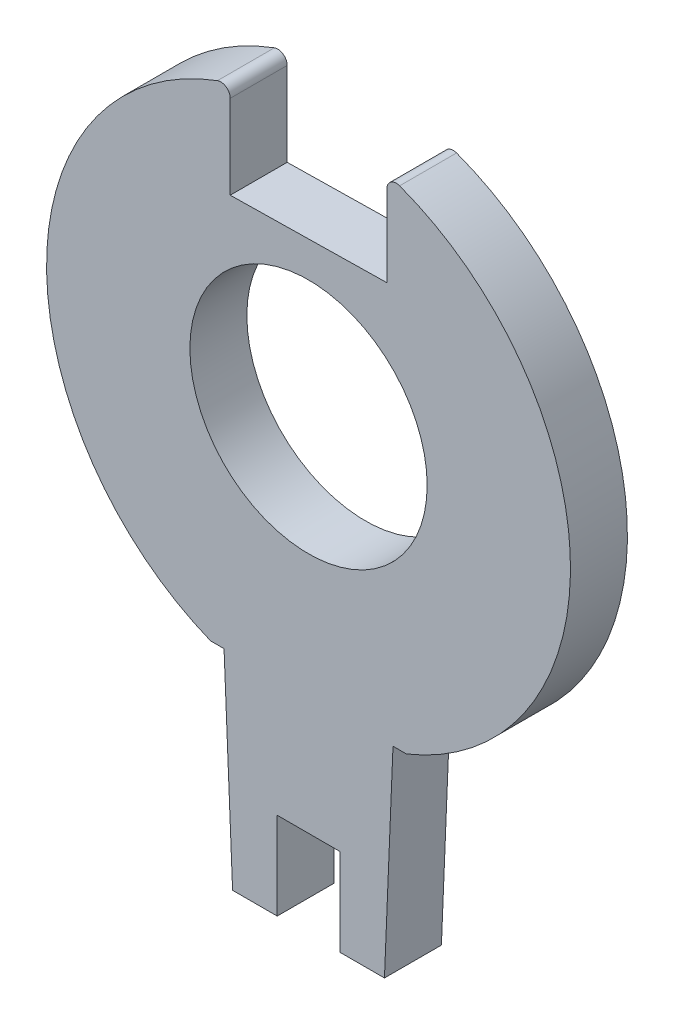
ISO-10303-21;
HEADER;
FILE_DESCRIPTION(('STEP AP214'),'2;1');
FILE_NAME('part.step','',(''),(''),'','','');
FILE_SCHEMA(('AUTOMOTIVE_DESIGN { 1 0 10303 214 1 1 1 1 }'));
ENDSEC;
DATA;
#1=APPLICATION_CONTEXT('core data for automotive mechanical design processes');
#2=APPLICATION_PROTOCOL_DEFINITION('international standard','automotive_design',2000,#1);
#3=PRODUCT_CONTEXT('',#1,'mechanical');
#4=PRODUCT('Part','Part','',(#3));
#5=PRODUCT_RELATED_PRODUCT_CATEGORY('part','',(#4));
#6=PRODUCT_DEFINITION_FORMATION('','',#4);
#7=PRODUCT_DEFINITION_CONTEXT('part definition',#1,'design');
#8=PRODUCT_DEFINITION('design','',#6,#7);
#9=PRODUCT_DEFINITION_SHAPE('','',#8);
#10=(LENGTH_UNIT() NAMED_UNIT(*) SI_UNIT(.MILLI.,.METRE.));
#11=(NAMED_UNIT(*) PLANE_ANGLE_UNIT() SI_UNIT($,.RADIAN.));
#12=(NAMED_UNIT(*) SI_UNIT($,.STERADIAN.) SOLID_ANGLE_UNIT());
#13=UNCERTAINTY_MEASURE_WITH_UNIT(LENGTH_MEASURE(1.E-05),#10,'distance_accuracy_value','');
#14=(GEOMETRIC_REPRESENTATION_CONTEXT(3) GLOBAL_UNCERTAINTY_ASSIGNED_CONTEXT((#13)) GLOBAL_UNIT_ASSIGNED_CONTEXT((#10,
#11,#12)) REPRESENTATION_CONTEXT('',''));
#15=CARTESIAN_POINT('',(0.,0.,0.));
#16=DIRECTION('',(0.,0.,1.));
#17=DIRECTION('',(1.,0.,0.));
#18=AXIS2_PLACEMENT_3D('',#15,#16,#17);
#19=CARTESIAN_POINT('',(0.,0.,3.));
#20=DIRECTION('',(0.,0.,1.));
#21=DIRECTION('',(1.,0.,0.));
#22=AXIS2_PLACEMENT_3D('',#19,#20,#21);
#23=PLANE('',#22);
#24=DIRECTION('',(0.0416305447121813,-0.999133073092352,0.));
#25=VECTOR('',#24,1.);
#26=CARTESIAN_POINT('',(-4.45,-12.8,3.));
#27=LINE('',#26,#25);
#28=CARTESIAN_POINT('',(-4.45,-12.8,3.));
#29=VERTEX_POINT('',#28);
#30=CARTESIAN_POINT('',(-4.,-23.6,3.));
#31=VERTEX_POINT('',#30);
#32=EDGE_CURVE('E212',#29,#31,#27,.T.);
#33=ORIENTED_EDGE('',*,*,#32,.T.);
#34=DIRECTION('',(1.,0.,0.));
#35=VECTOR('',#34,1.);
#36=CARTESIAN_POINT('',(-1.65,-23.6,3.));
#37=LINE('',#36,#35);
#38=CARTESIAN_POINT('',(-1.65,-23.6,3.));
#39=VERTEX_POINT('',#38);
#40=EDGE_CURVE('E120',#31,#39,#37,.T.);
#41=ORIENTED_EDGE('',*,*,#40,.T.);
#42=DIRECTION('',(0.,1.,0.));
#43=VECTOR('',#42,1.);
#44=CARTESIAN_POINT('',(-1.65,-23.6,3.));
#45=LINE('',#44,#43);
#46=CARTESIAN_POINT('',(-1.65,-19.,3.));
#47=VERTEX_POINT('',#46);
#48=EDGE_CURVE('E251',#39,#47,#45,.T.);
#49=ORIENTED_EDGE('',*,*,#48,.T.);
#50=DIRECTION('',(1.,0.,0.));
#51=VECTOR('',#50,1.);
#52=CARTESIAN_POINT('',(1.65,-19.,3.));
#53=LINE('',#52,#51);
#54=CARTESIAN_POINT('',(1.65,-19.,3.));
#55=VERTEX_POINT('',#54);
#56=EDGE_CURVE('E270',#47,#55,#53,.T.);
#57=ORIENTED_EDGE('',*,*,#56,.T.);
#58=DIRECTION('',(0.,-1.,0.));
#59=VECTOR('',#58,1.);
#60=CARTESIAN_POINT('',(1.65,-23.6,3.));
#61=LINE('',#60,#59);
#62=CARTESIAN_POINT('',(1.65,-23.6,3.));
#63=VERTEX_POINT('',#62);
#64=EDGE_CURVE('E267',#55,#63,#61,.T.);
#65=ORIENTED_EDGE('',*,*,#64,.T.);
#66=DIRECTION('',(1.,0.,0.));
#67=VECTOR('',#66,1.);
#68=CARTESIAN_POINT('',(4.,-23.6,3.));
#69=LINE('',#68,#67);
#70=CARTESIAN_POINT('',(4.,-23.6,3.));
#71=VERTEX_POINT('',#70);
#72=EDGE_CURVE('E269',#63,#71,#69,.T.);
#73=ORIENTED_EDGE('',*,*,#72,.T.);
#74=DIRECTION('',(0.0416305447121813,0.999133073092352,0.));
#75=VECTOR('',#74,1.);
#76=CARTESIAN_POINT('',(4.,-23.6,3.));
#77=LINE('',#76,#75);
#78=CARTESIAN_POINT('',(4.45,-12.8,3.));
#79=VERTEX_POINT('',#78);
#80=EDGE_CURVE('E272',#71,#79,#77,.T.);
#81=ORIENTED_EDGE('',*,*,#80,.T.);
#82=DIRECTION('',(1.,0.,0.));
#83=VECTOR('',#82,1.);
#84=CARTESIAN_POINT('',(4.45,-12.8,3.));
#85=LINE('',#84,#83);
#86=CARTESIAN_POINT('',(5.15751878329104,-12.8,3.));
#87=VERTEX_POINT('',#86);
#88=EDGE_CURVE('E278',#79,#87,#85,.T.);
#89=ORIENTED_EDGE('',*,*,#88,.T.);
#90=CARTESIAN_POINT('',(0.,0.,3.));
#91=DIRECTION('',(0.,0.,1.));
#92=DIRECTION('',(1.,0.,0.));
#93=AXIS2_PLACEMENT_3D('',#90,#91,#92);
#94=CIRCLE('',#93,13.8);
#95=CARTESIAN_POINT('',(4.79887218045113,12.9387335468234,3.));
#96=VERTEX_POINT('',#95);
#97=EDGE_CURVE('E280',#87,#96,#94,.T.);
#98=ORIENTED_EDGE('',*,*,#97,.T.);
#99=CARTESIAN_POINT('',(4.625,12.4699388530979,3.));
#100=DIRECTION('',(0.,0.,1.));
#101=DIRECTION('',(1.,0.,0.));
#102=AXIS2_PLACEMENT_3D('',#99,#100,#101);
#103=CIRCLE('',#102,0.499999999999999);
#104=CARTESIAN_POINT('',(4.125,12.4699388530979,3.));
#105=VERTEX_POINT('',#104);
#106=EDGE_CURVE('E282',#96,#105,#103,.T.);
#107=ORIENTED_EDGE('',*,*,#106,.T.);
#108=DIRECTION('',(0.,-1.,0.));
#109=VECTOR('',#108,1.);
#110=CARTESIAN_POINT('',(4.125,12.4699388530979,3.));
#111=LINE('',#110,#109);
#112=CARTESIAN_POINT('',(4.125,8.1852194205877,3.));
#113=VERTEX_POINT('',#112);
#114=EDGE_CURVE('E284',#105,#113,#111,.T.);
#115=ORIENTED_EDGE('',*,*,#114,.T.);
#116=DIRECTION('',(-0.999865707191088,-0.0163880317081075,0.));
#117=VECTOR('',#116,1.);
#118=CARTESIAN_POINT('',(-4.125,8.05,3.));
#119=LINE('',#118,#117);
#120=CARTESIAN_POINT('',(-4.125,8.05,3.));
#121=VERTEX_POINT('',#120);
#122=EDGE_CURVE('E286',#113,#121,#119,.T.);
#123=ORIENTED_EDGE('',*,*,#122,.T.);
#124=DIRECTION('',(0.,1.,0.));
#125=VECTOR('',#124,1.);
#126=CARTESIAN_POINT('',(-4.125,8.05,3.));
#127=LINE('',#126,#125);
#128=CARTESIAN_POINT('',(-4.125,12.4699388530979,3.));
#129=VERTEX_POINT('',#128);
#130=EDGE_CURVE('E163',#121,#129,#127,.T.);
#131=ORIENTED_EDGE('',*,*,#130,.T.);
#132=CARTESIAN_POINT('',(-4.625,12.4699388530979,3.));
#133=DIRECTION('',(0.,0.,1.));
#134=DIRECTION('',(1.,0.,0.));
#135=AXIS2_PLACEMENT_3D('',#132,#133,#134);
#136=CIRCLE('',#135,0.5);
#137=CARTESIAN_POINT('',(-4.79887218045113,12.9387335468234,3.));
#138=VERTEX_POINT('',#137);
#139=EDGE_CURVE('E157',#129,#138,#136,.T.);
#140=ORIENTED_EDGE('',*,*,#139,.T.);
#141=CARTESIAN_POINT('',(0.,0.,3.));
#142=DIRECTION('',(0.,0.,1.));
#143=DIRECTION('',(1.,0.,0.));
#144=AXIS2_PLACEMENT_3D('',#141,#142,#143);
#145=CIRCLE('',#144,13.8);
#146=CARTESIAN_POINT('',(-5.15751878329105,-12.8,3.));
#147=VERTEX_POINT('',#146);
#148=EDGE_CURVE('E161',#138,#147,#145,.T.);
#149=ORIENTED_EDGE('',*,*,#148,.T.);
#150=DIRECTION('',(1.,0.,0.));
#151=VECTOR('',#150,1.);
#152=CARTESIAN_POINT('',(-5.15751878329105,-12.8,3.));
#153=LINE('',#152,#151);
#154=EDGE_CURVE('E53',#147,#29,#153,.T.);
#155=ORIENTED_EDGE('',*,*,#154,.T.);
#156=EDGE_LOOP('',(#33,#41,#49,#57,#65,#73,#81,#89,#98,#107,#115,#123,#131,#140,#149,#155));
#157=FACE_BOUND('',#156,.T.);
#158=CARTESIAN_POINT('',(0.,0.,3.));
#159=DIRECTION('',(0.,0.,1.));
#160=DIRECTION('',(1.,0.,0.));
#161=AXIS2_PLACEMENT_3D('',#158,#159,#160);
#162=CIRCLE('',#161,6.25);
#163=CARTESIAN_POINT('',(6.25,0.,3.));
#164=VERTEX_POINT('',#163);
#165=EDGE_CURVE('E185',#164,#164,#162,.T.);
#166=ORIENTED_EDGE('',*,*,#165,.F.);
#167=EDGE_LOOP('',(#166));
#168=FACE_BOUND('',#167,.T.);
#169=ADVANCED_FACE('F36',(#157,#168),#23,.T.);
#170=CARTESIAN_POINT('',(0.,0.,0.));
#171=DIRECTION('',(0.,0.,1.));
#172=DIRECTION('',(1.,0.,0.));
#173=AXIS2_PLACEMENT_3D('',#170,#171,#172);
#174=PLANE('',#173);
#175=DIRECTION('',(0.0416305447121813,-0.999133073092352,0.));
#176=VECTOR('',#175,1.);
#177=CARTESIAN_POINT('',(-4.45,-12.8,0.));
#178=LINE('',#177,#176);
#179=CARTESIAN_POINT('',(-4.45,-12.8,0.));
#180=VERTEX_POINT('',#179);
#181=CARTESIAN_POINT('',(-4.,-23.6,0.));
#182=VERTEX_POINT('',#181);
#183=EDGE_CURVE('E181',#180,#182,#178,.T.);
#184=ORIENTED_EDGE('',*,*,#183,.F.);
#185=DIRECTION('',(1.,0.,0.));
#186=VECTOR('',#185,1.);
#187=CARTESIAN_POINT('',(-5.15751878329105,-12.8,0.));
#188=LINE('',#187,#186);
#189=CARTESIAN_POINT('',(-5.15751878329105,-12.8,0.));
#190=VERTEX_POINT('',#189);
#191=EDGE_CURVE('E112',#190,#180,#188,.T.);
#192=ORIENTED_EDGE('',*,*,#191,.F.);
#193=CARTESIAN_POINT('',(0.,0.,0.));
#194=DIRECTION('',(0.,0.,1.));
#195=DIRECTION('',(1.,0.,0.));
#196=AXIS2_PLACEMENT_3D('',#193,#194,#195);
#197=CIRCLE('',#196,13.8);
#198=CARTESIAN_POINT('',(-4.79887218045113,12.9387335468234,0.));
#199=VERTEX_POINT('',#198);
#200=EDGE_CURVE('E106',#199,#190,#197,.T.);
#201=ORIENTED_EDGE('',*,*,#200,.F.);
#202=CARTESIAN_POINT('',(-4.625,12.4699388530979,0.));
#203=DIRECTION('',(0.,0.,1.));
#204=DIRECTION('',(1.,0.,0.));
#205=AXIS2_PLACEMENT_3D('',#202,#203,#204);
#206=CIRCLE('',#205,0.5);
#207=CARTESIAN_POINT('',(-4.125,12.4699388530979,0.));
#208=VERTEX_POINT('',#207);
#209=EDGE_CURVE('E171',#208,#199,#206,.T.);
#210=ORIENTED_EDGE('',*,*,#209,.F.);
#211=DIRECTION('',(0.,1.,0.));
#212=VECTOR('',#211,1.);
#213=CARTESIAN_POINT('',(-4.125,8.05,0.));
#214=LINE('',#213,#212);
#215=CARTESIAN_POINT('',(-4.125,8.05,0.));
#216=VERTEX_POINT('',#215);
#217=EDGE_CURVE('E207',#216,#208,#214,.T.);
#218=ORIENTED_EDGE('',*,*,#217,.F.);
#219=DIRECTION('',(-0.999865707191088,-0.0163880317081075,0.));
#220=VECTOR('',#219,1.);
#221=CARTESIAN_POINT('',(-4.125,8.05,0.));
#222=LINE('',#221,#220);
#223=CARTESIAN_POINT('',(4.125,8.1852194205877,0.));
#224=VERTEX_POINT('',#223);
#225=EDGE_CURVE('E205',#224,#216,#222,.T.);
#226=ORIENTED_EDGE('',*,*,#225,.F.);
#227=DIRECTION('',(0.,-1.,0.));
#228=VECTOR('',#227,1.);
#229=CARTESIAN_POINT('',(4.125,12.4699388530979,0.));
#230=LINE('',#229,#228);
#231=CARTESIAN_POINT('',(4.125,12.4699388530979,0.));
#232=VERTEX_POINT('',#231);
#233=EDGE_CURVE('E203',#232,#224,#230,.T.);
#234=ORIENTED_EDGE('',*,*,#233,.F.);
#235=CARTESIAN_POINT('',(4.625,12.4699388530979,0.));
#236=DIRECTION('',(0.,0.,1.));
#237=DIRECTION('',(1.,0.,0.));
#238=AXIS2_PLACEMENT_3D('',#235,#236,#237);
#239=CIRCLE('',#238,0.499999999999999);
#240=CARTESIAN_POINT('',(4.79887218045113,12.9387335468234,0.));
#241=VERTEX_POINT('',#240);
#242=EDGE_CURVE('E201',#241,#232,#239,.T.);
#243=ORIENTED_EDGE('',*,*,#242,.F.);
#244=CARTESIAN_POINT('',(0.,0.,0.));
#245=DIRECTION('',(0.,0.,1.));
#246=DIRECTION('',(1.,0.,0.));
#247=AXIS2_PLACEMENT_3D('',#244,#245,#246);
#248=CIRCLE('',#247,13.8);
#249=CARTESIAN_POINT('',(5.15751878329104,-12.8,0.));
#250=VERTEX_POINT('',#249);
#251=EDGE_CURVE('E199',#250,#241,#248,.T.);
#252=ORIENTED_EDGE('',*,*,#251,.F.);
#253=DIRECTION('',(1.,0.,0.));
#254=VECTOR('',#253,1.);
#255=CARTESIAN_POINT('',(4.45,-12.8,0.));
#256=LINE('',#255,#254);
#257=CARTESIAN_POINT('',(4.45,-12.8,0.));
#258=VERTEX_POINT('',#257);
#259=EDGE_CURVE('E197',#258,#250,#256,.T.);
#260=ORIENTED_EDGE('',*,*,#259,.F.);
#261=DIRECTION('',(0.0416305447121813,0.999133073092352,0.));
#262=VECTOR('',#261,1.);
#263=CARTESIAN_POINT('',(4.,-23.6,0.));
#264=LINE('',#263,#262);
#265=CARTESIAN_POINT('',(4.,-23.6,0.));
#266=VERTEX_POINT('',#265);
#267=EDGE_CURVE('E195',#266,#258,#264,.T.);
#268=ORIENTED_EDGE('',*,*,#267,.F.);
#269=DIRECTION('',(1.,0.,0.));
#270=VECTOR('',#269,1.);
#271=CARTESIAN_POINT('',(4.,-23.6,0.));
#272=LINE('',#271,#270);
#273=CARTESIAN_POINT('',(1.65,-23.6,0.));
#274=VERTEX_POINT('',#273);
#275=EDGE_CURVE('E193',#274,#266,#272,.T.);
#276=ORIENTED_EDGE('',*,*,#275,.F.);
#277=DIRECTION('',(0.,-1.,0.));
#278=VECTOR('',#277,1.);
#279=CARTESIAN_POINT('',(1.65,-23.6,0.));
#280=LINE('',#279,#278);
#281=CARTESIAN_POINT('',(1.65,-19.,0.));
#282=VERTEX_POINT('',#281);
#283=EDGE_CURVE('E191',#282,#274,#280,.T.);
#284=ORIENTED_EDGE('',*,*,#283,.F.);
#285=DIRECTION('',(1.,0.,0.));
#286=VECTOR('',#285,1.);
#287=CARTESIAN_POINT('',(1.65,-19.,0.));
#288=LINE('',#287,#286);
#289=CARTESIAN_POINT('',(-1.65,-19.,0.));
#290=VERTEX_POINT('',#289);
#291=EDGE_CURVE('E189',#290,#282,#288,.T.);
#292=ORIENTED_EDGE('',*,*,#291,.F.);
#293=DIRECTION('',(0.,1.,0.));
#294=VECTOR('',#293,1.);
#295=CARTESIAN_POINT('',(-1.65,-23.6,0.));
#296=LINE('',#295,#294);
#297=CARTESIAN_POINT('',(-1.65,-23.6,0.));
#298=VERTEX_POINT('',#297);
#299=EDGE_CURVE('E187',#298,#290,#296,.T.);
#300=ORIENTED_EDGE('',*,*,#299,.F.);
#301=DIRECTION('',(1.,0.,0.));
#302=VECTOR('',#301,1.);
#303=CARTESIAN_POINT('',(-1.65,-23.6,0.));
#304=LINE('',#303,#302);
#305=EDGE_CURVE('E184',#182,#298,#304,.T.);
#306=ORIENTED_EDGE('',*,*,#305,.F.);
#307=EDGE_LOOP('',(#184,#192,#201,#210,#218,#226,#234,#243,#252,#260,#268,#276,#284,#292,#300,#306));
#308=FACE_BOUND('',#307,.T.);
#309=CARTESIAN_POINT('',(0.,0.,0.));
#310=DIRECTION('',(0.,0.,1.));
#311=DIRECTION('',(1.,0.,0.));
#312=AXIS2_PLACEMENT_3D('',#309,#310,#311);
#313=CIRCLE('',#312,6.25);
#314=CARTESIAN_POINT('',(6.25,0.,0.));
#315=VERTEX_POINT('',#314);
#316=EDGE_CURVE('E485',#315,#315,#313,.T.);
#317=ORIENTED_EDGE('',*,*,#316,.T.);
#318=EDGE_LOOP('',(#317));
#319=FACE_BOUND('',#318,.T.);
#320=ADVANCED_FACE('F255',(#308,#319),#174,.F.);
#321=CARTESIAN_POINT('',(-4.45,-12.8,3.));
#322=DIRECTION('',(0.999133073092352,0.0416305447121813,0.));
#323=DIRECTION('',(-0.0416305447121813,0.999133073092352,0.));
#324=AXIS2_PLACEMENT_3D('',#321,#322,#323);
#325=PLANE('',#324);
#326=ORIENTED_EDGE('',*,*,#183,.T.);
#327=DIRECTION('',(0.,0.,-1.));
#328=VECTOR('',#327,1.);
#329=CARTESIAN_POINT('',(-4.,-23.6,3.));
#330=LINE('',#329,#328);
#331=EDGE_CURVE('E11',#31,#182,#330,.T.);
#332=ORIENTED_EDGE('',*,*,#331,.F.);
#333=ORIENTED_EDGE('',*,*,#32,.F.);
#334=DIRECTION('',(0.,0.,-1.));
#335=VECTOR('',#334,1.);
#336=CARTESIAN_POINT('',(-4.45,-12.8,3.));
#337=LINE('',#336,#335);
#338=EDGE_CURVE('E177',#29,#180,#337,.T.);
#339=ORIENTED_EDGE('',*,*,#338,.T.);
#340=EDGE_LOOP('',(#326,#332,#333,#339));
#341=FACE_BOUND('',#340,.T.);
#342=ADVANCED_FACE('F38',(#341),#325,.F.);
#343=CARTESIAN_POINT('',(-1.65,-23.6,3.));
#344=DIRECTION('',(0.,1.,0.));
#345=DIRECTION('',(0.,0.,1.));
#346=AXIS2_PLACEMENT_3D('',#343,#344,#345);
#347=PLANE('',#346);
#348=ORIENTED_EDGE('',*,*,#305,.T.);
#349=DIRECTION('',(0.,0.,-1.));
#350=VECTOR('',#349,1.);
#351=CARTESIAN_POINT('',(-1.65,-23.6,3.));
#352=LINE('',#351,#350);
#353=EDGE_CURVE('E45',#39,#298,#352,.T.);
#354=ORIENTED_EDGE('',*,*,#353,.F.);
#355=ORIENTED_EDGE('',*,*,#40,.F.);
#356=ORIENTED_EDGE('',*,*,#331,.T.);
#357=EDGE_LOOP('',(#348,#354,#355,#356));
#358=FACE_BOUND('',#357,.T.);
#359=ADVANCED_FACE('F320',(#358),#347,.F.);
#360=CARTESIAN_POINT('',(-1.65,-23.6,3.));
#361=DIRECTION('',(-1.,0.,0.));
#362=DIRECTION('',(0.,-1.,0.));
#363=AXIS2_PLACEMENT_3D('',#360,#361,#362);
#364=PLANE('',#363);
#365=ORIENTED_EDGE('',*,*,#299,.T.);
#366=DIRECTION('',(0.,0.,-1.));
#367=VECTOR('',#366,1.);
#368=CARTESIAN_POINT('',(-1.65,-19.,3.));
#369=LINE('',#368,#367);
#370=EDGE_CURVE('E243',#47,#290,#369,.T.);
#371=ORIENTED_EDGE('',*,*,#370,.F.);
#372=ORIENTED_EDGE('',*,*,#48,.F.);
#373=ORIENTED_EDGE('',*,*,#353,.T.);
#374=EDGE_LOOP('',(#365,#371,#372,#373));
#375=FACE_BOUND('',#374,.T.);
#376=ADVANCED_FACE('F249',(#375),#364,.F.);
#377=CARTESIAN_POINT('',(1.65,-19.,3.));
#378=DIRECTION('',(0.,1.,0.));
#379=DIRECTION('',(0.,0.,1.));
#380=AXIS2_PLACEMENT_3D('',#377,#378,#379);
#381=PLANE('',#380);
#382=ORIENTED_EDGE('',*,*,#291,.T.);
#383=DIRECTION('',(0.,0.,-1.));
#384=VECTOR('',#383,1.);
#385=CARTESIAN_POINT('',(1.65,-19.,3.));
#386=LINE('',#385,#384);
#387=EDGE_CURVE('E240',#55,#282,#386,.T.);
#388=ORIENTED_EDGE('',*,*,#387,.F.);
#389=ORIENTED_EDGE('',*,*,#56,.F.);
#390=ORIENTED_EDGE('',*,*,#370,.T.);
#391=EDGE_LOOP('',(#382,#388,#389,#390));
#392=FACE_BOUND('',#391,.T.);
#393=ADVANCED_FACE('F261',(#392),#381,.F.);
#394=CARTESIAN_POINT('',(1.65,-23.6,3.));
#395=DIRECTION('',(1.,0.,0.));
#396=DIRECTION('',(0.,1.,0.));
#397=AXIS2_PLACEMENT_3D('',#394,#395,#396);
#398=PLANE('',#397);
#399=ORIENTED_EDGE('',*,*,#283,.T.);
#400=DIRECTION('',(0.,0.,-1.));
#401=VECTOR('',#400,1.);
#402=CARTESIAN_POINT('',(1.65,-23.6,3.));
#403=LINE('',#402,#401);
#404=EDGE_CURVE('E237',#63,#274,#403,.T.);
#405=ORIENTED_EDGE('',*,*,#404,.F.);
#406=ORIENTED_EDGE('',*,*,#64,.F.);
#407=ORIENTED_EDGE('',*,*,#387,.T.);
#408=EDGE_LOOP('',(#399,#405,#406,#407));
#409=FACE_BOUND('',#408,.T.);
#410=ADVANCED_FACE('F265',(#409),#398,.F.);
#411=CARTESIAN_POINT('',(4.,-23.6,3.));
#412=DIRECTION('',(0.,1.,0.));
#413=DIRECTION('',(-1.,0.,0.));
#414=AXIS2_PLACEMENT_3D('',#411,#412,#413);
#415=PLANE('',#414);
#416=ORIENTED_EDGE('',*,*,#275,.T.);
#417=DIRECTION('',(0.,0.,-1.));
#418=VECTOR('',#417,1.);
#419=CARTESIAN_POINT('',(4.,-23.6,3.));
#420=LINE('',#419,#418);
#421=EDGE_CURVE('E234',#71,#266,#420,.T.);
#422=ORIENTED_EDGE('',*,*,#421,.F.);
#423=ORIENTED_EDGE('',*,*,#72,.F.);
#424=ORIENTED_EDGE('',*,*,#404,.T.);
#425=EDGE_LOOP('',(#416,#422,#423,#424));
#426=FACE_BOUND('',#425,.T.);
#427=ADVANCED_FACE('F333',(#426),#415,.F.);
#428=CARTESIAN_POINT('',(4.,-23.6,3.));
#429=DIRECTION('',(-0.999133073092352,0.0416305447121813,0.));
#430=DIRECTION('',(-0.0416305447121813,-0.999133073092352,0.));
#431=AXIS2_PLACEMENT_3D('',#428,#429,#430);
#432=PLANE('',#431);
#433=ORIENTED_EDGE('',*,*,#267,.T.);
#434=DIRECTION('',(0.,0.,-1.));
#435=VECTOR('',#434,1.);
#436=CARTESIAN_POINT('',(4.45,-12.8,3.));
#437=LINE('',#436,#435);
#438=EDGE_CURVE('E231',#79,#258,#437,.T.);
#439=ORIENTED_EDGE('',*,*,#438,.F.);
#440=ORIENTED_EDGE('',*,*,#80,.F.);
#441=ORIENTED_EDGE('',*,*,#421,.T.);
#442=EDGE_LOOP('',(#433,#439,#440,#441));
#443=FACE_BOUND('',#442,.T.);
#444=ADVANCED_FACE('F336',(#443),#432,.F.);
#445=CARTESIAN_POINT('',(4.45,-12.8,3.));
#446=DIRECTION('',(0.,1.,0.));
#447=DIRECTION('',(0.,0.,1.));
#448=AXIS2_PLACEMENT_3D('',#445,#446,#447);
#449=PLANE('',#448);
#450=ORIENTED_EDGE('',*,*,#259,.T.);
#451=DIRECTION('',(0.,0.,-1.));
#452=VECTOR('',#451,1.);
#453=CARTESIAN_POINT('',(5.15751878329104,-12.8,3.));
#454=LINE('',#453,#452);
#455=EDGE_CURVE('E228',#87,#250,#454,.T.);
#456=ORIENTED_EDGE('',*,*,#455,.F.);
#457=ORIENTED_EDGE('',*,*,#88,.F.);
#458=ORIENTED_EDGE('',*,*,#438,.T.);
#459=EDGE_LOOP('',(#450,#456,#457,#458));
#460=FACE_BOUND('',#459,.T.);
#461=ADVANCED_FACE('F340',(#460),#449,.F.);
#462=CARTESIAN_POINT('',(0.,0.,3.));
#463=DIRECTION('',(0.,0.,-1.));
#464=DIRECTION('',(-1.,0.,0.));
#465=AXIS2_PLACEMENT_3D('',#462,#463,#464);
#466=CYLINDRICAL_SURFACE('',#465,13.8);
#467=ORIENTED_EDGE('',*,*,#251,.T.);
#468=DIRECTION('',(0.,0.,-1.));
#469=VECTOR('',#468,1.);
#470=CARTESIAN_POINT('',(4.79887218045113,12.9387335468234,3.));
#471=LINE('',#470,#469);
#472=EDGE_CURVE('E225',#96,#241,#471,.T.);
#473=ORIENTED_EDGE('',*,*,#472,.F.);
#474=ORIENTED_EDGE('',*,*,#97,.F.);
#475=ORIENTED_EDGE('',*,*,#455,.T.);
#476=EDGE_LOOP('',(#467,#473,#474,#475));
#477=FACE_BOUND('',#476,.T.);
#478=ADVANCED_FACE('F344',(#477),#466,.T.);
#479=CARTESIAN_POINT('',(4.625,12.4699388530979,3.));
#480=DIRECTION('',(0.,0.,-1.));
#481=DIRECTION('',(-1.,0.,0.));
#482=AXIS2_PLACEMENT_3D('',#479,#480,#481);
#483=CYLINDRICAL_SURFACE('',#482,0.499999999999999);
#484=ORIENTED_EDGE('',*,*,#242,.T.);
#485=DIRECTION('',(0.,0.,-1.));
#486=VECTOR('',#485,1.);
#487=CARTESIAN_POINT('',(4.125,12.4699388530979,3.));
#488=LINE('',#487,#486);
#489=EDGE_CURVE('E222',#105,#232,#488,.T.);
#490=ORIENTED_EDGE('',*,*,#489,.F.);
#491=ORIENTED_EDGE('',*,*,#106,.F.);
#492=ORIENTED_EDGE('',*,*,#472,.T.);
#493=EDGE_LOOP('',(#484,#490,#491,#492));
#494=FACE_BOUND('',#493,.T.);
#495=ADVANCED_FACE('F348',(#494),#483,.T.);
#496=CARTESIAN_POINT('',(4.125,12.4699388530979,3.));
#497=DIRECTION('',(1.,0.,0.));
#498=DIRECTION('',(0.,0.,-1.));
#499=AXIS2_PLACEMENT_3D('',#496,#497,#498);
#500=PLANE('',#499);
#501=ORIENTED_EDGE('',*,*,#233,.T.);
#502=DIRECTION('',(0.,0.,-1.));
#503=VECTOR('',#502,1.);
#504=CARTESIAN_POINT('',(4.125,8.1852194205877,3.));
#505=LINE('',#504,#503);
#506=EDGE_CURVE('E219',#113,#224,#505,.T.);
#507=ORIENTED_EDGE('',*,*,#506,.F.);
#508=ORIENTED_EDGE('',*,*,#114,.F.);
#509=ORIENTED_EDGE('',*,*,#489,.T.);
#510=EDGE_LOOP('',(#501,#507,#508,#509));
#511=FACE_BOUND('',#510,.T.);
#512=ADVANCED_FACE('F352',(#511),#500,.F.);
#513=CARTESIAN_POINT('',(-4.125,8.05,3.));
#514=DIRECTION('',(0.0163880317081075,-0.999865707191088,0.));
#515=DIRECTION('',(0.999865707191088,0.0163880317081075,0.));
#516=AXIS2_PLACEMENT_3D('',#513,#514,#515);
#517=PLANE('',#516);
#518=ORIENTED_EDGE('',*,*,#225,.T.);
#519=DIRECTION('',(0.,0.,-1.));
#520=VECTOR('',#519,1.);
#521=CARTESIAN_POINT('',(-4.125,8.05,3.));
#522=LINE('',#521,#520);
#523=EDGE_CURVE('E216',#121,#216,#522,.T.);
#524=ORIENTED_EDGE('',*,*,#523,.F.);
#525=ORIENTED_EDGE('',*,*,#122,.F.);
#526=ORIENTED_EDGE('',*,*,#506,.T.);
#527=EDGE_LOOP('',(#518,#524,#525,#526));
#528=FACE_BOUND('',#527,.T.);
#529=ADVANCED_FACE('F292',(#528),#517,.F.);
#530=CARTESIAN_POINT('',(-4.125,8.05,3.));
#531=DIRECTION('',(-1.,0.,0.));
#532=DIRECTION('',(0.,0.,1.));
#533=AXIS2_PLACEMENT_3D('',#530,#531,#532);
#534=PLANE('',#533);
#535=ORIENTED_EDGE('',*,*,#217,.T.);
#536=DIRECTION('',(0.,0.,-1.));
#537=VECTOR('',#536,1.);
#538=CARTESIAN_POINT('',(-4.125,12.4699388530979,3.));
#539=LINE('',#538,#537);
#540=EDGE_CURVE('E172',#129,#208,#539,.T.);
#541=ORIENTED_EDGE('',*,*,#540,.F.);
#542=ORIENTED_EDGE('',*,*,#130,.F.);
#543=ORIENTED_EDGE('',*,*,#523,.T.);
#544=EDGE_LOOP('',(#535,#541,#542,#543));
#545=FACE_BOUND('',#544,.T.);
#546=ADVANCED_FACE('F296',(#545),#534,.F.);
#547=CARTESIAN_POINT('',(-4.625,12.4699388530979,3.));
#548=DIRECTION('',(0.,0.,-1.));
#549=DIRECTION('',(-1.,0.,0.));
#550=AXIS2_PLACEMENT_3D('',#547,#548,#549);
#551=CYLINDRICAL_SURFACE('',#550,0.5);
#552=ORIENTED_EDGE('',*,*,#209,.T.);
#553=DIRECTION('',(0.,0.,-1.));
#554=VECTOR('',#553,1.);
#555=CARTESIAN_POINT('',(-4.79887218045113,12.9387335468234,3.));
#556=LINE('',#555,#554);
#557=EDGE_CURVE('E168',#138,#199,#556,.T.);
#558=ORIENTED_EDGE('',*,*,#557,.F.);
#559=ORIENTED_EDGE('',*,*,#139,.F.);
#560=ORIENTED_EDGE('',*,*,#540,.T.);
#561=EDGE_LOOP('',(#552,#558,#559,#560));
#562=FACE_BOUND('',#561,.T.);
#563=ADVANCED_FACE('F169',(#562),#551,.T.);
#564=CARTESIAN_POINT('',(0.,0.,3.));
#565=DIRECTION('',(0.,0.,-1.));
#566=DIRECTION('',(-1.,0.,0.));
#567=AXIS2_PLACEMENT_3D('',#564,#565,#566);
#568=CYLINDRICAL_SURFACE('',#567,13.8);
#569=ORIENTED_EDGE('',*,*,#200,.T.);
#570=DIRECTION('',(0.,0.,-1.));
#571=VECTOR('',#570,1.);
#572=CARTESIAN_POINT('',(-5.15751878329105,-12.8,3.));
#573=LINE('',#572,#571);
#574=EDGE_CURVE('E173',#147,#190,#573,.T.);
#575=ORIENTED_EDGE('',*,*,#574,.F.);
#576=ORIENTED_EDGE('',*,*,#148,.F.);
#577=ORIENTED_EDGE('',*,*,#557,.T.);
#578=EDGE_LOOP('',(#569,#575,#576,#577));
#579=FACE_BOUND('',#578,.T.);
#580=ADVANCED_FACE('F175',(#579),#568,.T.);
#581=CARTESIAN_POINT('',(-5.15751878329105,-12.8,3.));
#582=DIRECTION('',(0.,1.,0.));
#583=DIRECTION('',(0.,0.,1.));
#584=AXIS2_PLACEMENT_3D('',#581,#582,#583);
#585=PLANE('',#584);
#586=ORIENTED_EDGE('',*,*,#191,.T.);
#587=ORIENTED_EDGE('',*,*,#338,.F.);
#588=ORIENTED_EDGE('',*,*,#154,.F.);
#589=ORIENTED_EDGE('',*,*,#574,.T.);
#590=EDGE_LOOP('',(#586,#587,#588,#589));
#591=FACE_BOUND('',#590,.T.);
#592=ADVANCED_FACE('F300',(#591),#585,.F.);
#593=CARTESIAN_POINT('',(0.,0.,3.));
#594=DIRECTION('',(0.,0.,-1.));
#595=DIRECTION('',(-1.,0.,0.));
#596=AXIS2_PLACEMENT_3D('',#593,#594,#595);
#597=CYLINDRICAL_SURFACE('',#596,6.25);
#598=ORIENTED_EDGE('',*,*,#165,.T.);
#599=EDGE_LOOP('',(#598));
#600=FACE_BOUND('',#599,.T.);
#601=ORIENTED_EDGE('',*,*,#316,.F.);
#602=EDGE_LOOP('',(#601));
#603=FACE_BOUND('',#602,.T.);
#604=ADVANCED_FACE('F302',(#600,#603),#597,.F.);
#605=CLOSED_SHELL('',(#169,#320,#342,#359,#376,#393,#410,#427,#444,#461,#478,#495,#512,#529,
#546,#563,#580,#592,#604));
#606=MANIFOLD_SOLID_BREP('B2',#605);
#607=ADVANCED_BREP_SHAPE_REPRESENTATION('',(#18,#606),#14);
#608=SHAPE_DEFINITION_REPRESENTATION(#9,#607);
ENDSEC;
END-ISO-10303-21;
